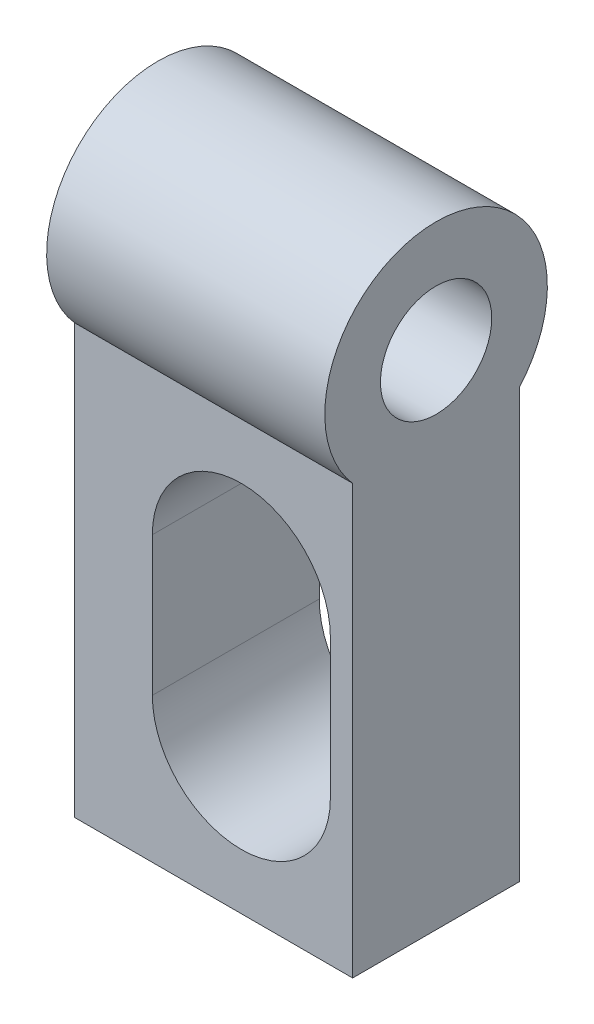
ISO-10303-21;
HEADER;
FILE_DESCRIPTION(('STEP AP214'),'2;1');
FILE_NAME('part.step','',(''),(''),'','','');
FILE_SCHEMA(('AUTOMOTIVE_DESIGN { 1 0 10303 214 1 1 1 1 }'));
ENDSEC;
DATA;
#1=APPLICATION_CONTEXT('core data for automotive mechanical design processes');
#2=APPLICATION_PROTOCOL_DEFINITION('international standard','automotive_design',2000,#1);
#3=PRODUCT_CONTEXT('',#1,'mechanical');
#4=PRODUCT('Part','Part','',(#3));
#5=PRODUCT_RELATED_PRODUCT_CATEGORY('part','',(#4));
#6=PRODUCT_DEFINITION_FORMATION('','',#4);
#7=PRODUCT_DEFINITION_CONTEXT('part definition',#1,'design');
#8=PRODUCT_DEFINITION('design','',#6,#7);
#9=PRODUCT_DEFINITION_SHAPE('','',#8);
#10=(LENGTH_UNIT() NAMED_UNIT(*) SI_UNIT(.MILLI.,.METRE.));
#11=(NAMED_UNIT(*) PLANE_ANGLE_UNIT() SI_UNIT($,.RADIAN.));
#12=(NAMED_UNIT(*) SI_UNIT($,.STERADIAN.) SOLID_ANGLE_UNIT());
#13=UNCERTAINTY_MEASURE_WITH_UNIT(LENGTH_MEASURE(1.E-05),#10,'distance_accuracy_value','');
#14=(GEOMETRIC_REPRESENTATION_CONTEXT(3) GLOBAL_UNCERTAINTY_ASSIGNED_CONTEXT((#13)) GLOBAL_UNIT_ASSIGNED_CONTEXT((#10,
#11,#12)) REPRESENTATION_CONTEXT('',''));
#15=CARTESIAN_POINT('',(0.,0.,0.));
#16=DIRECTION('',(0.,0.,1.));
#17=DIRECTION('',(1.,0.,0.));
#18=AXIS2_PLACEMENT_3D('',#15,#16,#17);
#19=CARTESIAN_POINT('',(5.,0.,0.));
#20=DIRECTION('',(0.,0.,-1.));
#21=DIRECTION('',(0.,1.,0.));
#22=AXIS2_PLACEMENT_3D('',#19,#20,#21);
#23=PLANE('',#22);
#24=CARTESIAN_POINT('',(8.,5.1,0.));
#25=DIRECTION('',(0.,0.,-1.));
#26=DIRECTION('',(0.,1.,0.));
#27=AXIS2_PLACEMENT_3D('',#24,#25,#26);
#28=CIRCLE('',#27,1.6);
#29=CARTESIAN_POINT('',(9.6,5.1,0.));
#30=VERTEX_POINT('',#29);
#31=CARTESIAN_POINT('',(6.4,5.1,0.));
#32=VERTEX_POINT('',#31);
#33=EDGE_CURVE('E136',#30,#32,#28,.F.);
#34=ORIENTED_EDGE('',*,*,#33,.F.);
#35=DIRECTION('',(0.,1.,0.));
#36=VECTOR('',#35,1.);
#37=CARTESIAN_POINT('',(9.6,0.,0.));
#38=LINE('',#37,#36);
#39=CARTESIAN_POINT('',(9.6,2.6,0.));
#40=VERTEX_POINT('',#39);
#41=EDGE_CURVE('E142',#40,#30,#38,.T.);
#42=ORIENTED_EDGE('',*,*,#41,.F.);
#43=CARTESIAN_POINT('',(8.,2.6,0.));
#44=DIRECTION('',(0.,0.,-1.));
#45=DIRECTION('',(0.,1.,0.));
#46=AXIS2_PLACEMENT_3D('',#43,#44,#45);
#47=CIRCLE('',#46,1.6);
#48=CARTESIAN_POINT('',(6.4,2.6,0.));
#49=VERTEX_POINT('',#48);
#50=EDGE_CURVE('E140',#49,#40,#47,.F.);
#51=ORIENTED_EDGE('',*,*,#50,.F.);
#52=DIRECTION('',(0.,-1.,0.));
#53=VECTOR('',#52,1.);
#54=CARTESIAN_POINT('',(6.4,0.,0.));
#55=LINE('',#54,#53);
#56=EDGE_CURVE('E138',#32,#49,#55,.T.);
#57=ORIENTED_EDGE('',*,*,#56,.F.);
#58=EDGE_LOOP('',(#34,#42,#51,#57));
#59=FACE_BOUND('',#58,.T.);
#60=DIRECTION('',(0.,1.,0.));
#61=VECTOR('',#60,1.);
#62=CARTESIAN_POINT('',(5.,0.,0.));
#63=LINE('',#62,#61);
#64=CARTESIAN_POINT('',(5.,0.,0.));
#65=VERTEX_POINT('',#64);
#66=CARTESIAN_POINT('',(5.,7.7,0.));
#67=VERTEX_POINT('',#66);
#68=EDGE_CURVE('E102',#65,#67,#63,.T.);
#69=ORIENTED_EDGE('',*,*,#68,.F.);
#70=DIRECTION('',(-1.,0.,0.));
#71=VECTOR('',#70,1.);
#72=CARTESIAN_POINT('',(5.,0.,0.));
#73=LINE('',#72,#71);
#74=CARTESIAN_POINT('',(10.,0.,0.));
#75=VERTEX_POINT('',#74);
#76=EDGE_CURVE('E44',#75,#65,#73,.T.);
#77=ORIENTED_EDGE('',*,*,#76,.F.);
#78=DIRECTION('',(0.,-1.,0.));
#79=VECTOR('',#78,1.);
#80=CARTESIAN_POINT('',(10.,0.,0.));
#81=LINE('',#80,#79);
#82=CARTESIAN_POINT('',(10.,7.7,0.));
#83=VERTEX_POINT('',#82);
#84=EDGE_CURVE('E127',#83,#75,#81,.T.);
#85=ORIENTED_EDGE('',*,*,#84,.F.);
#86=DIRECTION('',(-1.,0.,0.));
#87=VECTOR('',#86,1.);
#88=CARTESIAN_POINT('',(5.,7.7,0.));
#89=LINE('',#88,#87);
#90=EDGE_CURVE('E11',#83,#67,#89,.T.);
#91=ORIENTED_EDGE('',*,*,#90,.T.);
#92=EDGE_LOOP('',(#69,#77,#85,#91));
#93=FACE_BOUND('',#92,.T.);
#94=ADVANCED_FACE('F35',(#59,#93),#23,.F.);
#95=CARTESIAN_POINT('',(5.,0.,-3.));
#96=DIRECTION('',(0.,0.,1.));
#97=DIRECTION('',(1.,0.,0.));
#98=AXIS2_PLACEMENT_3D('',#95,#96,#97);
#99=PLANE('',#98);
#100=CARTESIAN_POINT('',(8.,5.1,-3.));
#101=DIRECTION('',(0.,0.,1.));
#102=DIRECTION('',(1.,0.,0.));
#103=AXIS2_PLACEMENT_3D('',#100,#101,#102);
#104=CIRCLE('',#103,1.6);
#105=CARTESIAN_POINT('',(9.6,5.1,-3.));
#106=VERTEX_POINT('',#105);
#107=CARTESIAN_POINT('',(6.4,5.1,-3.));
#108=VERTEX_POINT('',#107);
#109=EDGE_CURVE('E161',#106,#108,#104,.T.);
#110=ORIENTED_EDGE('',*,*,#109,.T.);
#111=DIRECTION('',(0.,-1.,0.));
#112=VECTOR('',#111,1.);
#113=CARTESIAN_POINT('',(6.4,5.1,-3.));
#114=LINE('',#113,#112);
#115=CARTESIAN_POINT('',(6.4,2.6,-3.));
#116=VERTEX_POINT('',#115);
#117=EDGE_CURVE('E148',#108,#116,#114,.T.);
#118=ORIENTED_EDGE('',*,*,#117,.T.);
#119=CARTESIAN_POINT('',(8.,2.6,-3.));
#120=DIRECTION('',(0.,0.,1.));
#121=DIRECTION('',(1.,0.,0.));
#122=AXIS2_PLACEMENT_3D('',#119,#120,#121);
#123=CIRCLE('',#122,1.6);
#124=CARTESIAN_POINT('',(9.6,2.6,-3.));
#125=VERTEX_POINT('',#124);
#126=EDGE_CURVE('E155',#116,#125,#123,.T.);
#127=ORIENTED_EDGE('',*,*,#126,.T.);
#128=DIRECTION('',(0.,1.,0.));
#129=VECTOR('',#128,1.);
#130=CARTESIAN_POINT('',(9.6,5.1,-3.));
#131=LINE('',#130,#129);
#132=EDGE_CURVE('E158',#125,#106,#131,.T.);
#133=ORIENTED_EDGE('',*,*,#132,.T.);
#134=EDGE_LOOP('',(#110,#118,#127,#133));
#135=FACE_BOUND('',#134,.T.);
#136=DIRECTION('',(0.,-1.,0.));
#137=VECTOR('',#136,1.);
#138=CARTESIAN_POINT('',(5.,0.,-3.));
#139=LINE('',#138,#137);
#140=CARTESIAN_POINT('',(5.,7.7,-3.));
#141=VERTEX_POINT('',#140);
#142=CARTESIAN_POINT('',(5.,0.,-3.));
#143=VERTEX_POINT('',#142);
#144=EDGE_CURVE('E51',#141,#143,#139,.T.);
#145=ORIENTED_EDGE('',*,*,#144,.F.);
#146=DIRECTION('',(-1.,0.,0.));
#147=VECTOR('',#146,1.);
#148=CARTESIAN_POINT('',(5.,7.7,-3.));
#149=LINE('',#148,#147);
#150=CARTESIAN_POINT('',(10.,7.7,-3.));
#151=VERTEX_POINT('',#150);
#152=EDGE_CURVE('E119',#151,#141,#149,.T.);
#153=ORIENTED_EDGE('',*,*,#152,.F.);
#154=DIRECTION('',(0.,1.,0.));
#155=VECTOR('',#154,1.);
#156=CARTESIAN_POINT('',(10.,0.,-3.));
#157=LINE('',#156,#155);
#158=CARTESIAN_POINT('',(10.,0.,-3.));
#159=VERTEX_POINT('',#158);
#160=EDGE_CURVE('E130',#159,#151,#157,.T.);
#161=ORIENTED_EDGE('',*,*,#160,.F.);
#162=DIRECTION('',(-1.,0.,0.));
#163=VECTOR('',#162,1.);
#164=CARTESIAN_POINT('',(5.,0.,-3.));
#165=LINE('',#164,#163);
#166=EDGE_CURVE('E117',#159,#143,#165,.T.);
#167=ORIENTED_EDGE('',*,*,#166,.T.);
#168=EDGE_LOOP('',(#145,#153,#161,#167));
#169=FACE_BOUND('',#168,.T.);
#170=ADVANCED_FACE('F168',(#135,#169),#99,.F.);
#171=CARTESIAN_POINT('',(5.,9.0228756555323,-1.5));
#172=DIRECTION('',(-1.,0.,0.));
#173=DIRECTION('',(0.,0.,1.));
#174=AXIS2_PLACEMENT_3D('',#171,#172,#173);
#175=CYLINDRICAL_SURFACE('',#174,2.);
#176=ORIENTED_EDGE('',*,*,#152,.T.);
#177=CARTESIAN_POINT('',(5.,9.0228756555323,-1.5));
#178=DIRECTION('',(-1.,0.,0.));
#179=DIRECTION('',(0.,0.,1.));
#180=AXIS2_PLACEMENT_3D('',#177,#178,#179);
#181=CIRCLE('',#180,2.);
#182=EDGE_CURVE('E111',#141,#67,#181,.F.);
#183=ORIENTED_EDGE('',*,*,#182,.T.);
#184=ORIENTED_EDGE('',*,*,#90,.F.);
#185=CARTESIAN_POINT('',(10.,9.0228756555323,-1.5));
#186=DIRECTION('',(1.,0.,0.));
#187=DIRECTION('',(0.,0.,-1.));
#188=AXIS2_PLACEMENT_3D('',#185,#186,#187);
#189=CIRCLE('',#188,2.);
#190=EDGE_CURVE('E133',#83,#151,#189,.F.);
#191=ORIENTED_EDGE('',*,*,#190,.T.);
#192=EDGE_LOOP('',(#176,#183,#184,#191));
#193=FACE_BOUND('',#192,.T.);
#194=ADVANCED_FACE('F37',(#193),#175,.T.);
#195=CARTESIAN_POINT('',(5.,0.,0.));
#196=DIRECTION('',(0.,1.,0.));
#197=DIRECTION('',(0.,0.,1.));
#198=AXIS2_PLACEMENT_3D('',#195,#196,#197);
#199=PLANE('',#198);
#200=DIRECTION('',(0.,0.,1.));
#201=VECTOR('',#200,1.);
#202=CARTESIAN_POINT('',(5.,0.,0.));
#203=LINE('',#202,#201);
#204=EDGE_CURVE('E98',#143,#65,#203,.T.);
#205=ORIENTED_EDGE('',*,*,#204,.F.);
#206=ORIENTED_EDGE('',*,*,#166,.F.);
#207=DIRECTION('',(0.,0.,-1.));
#208=VECTOR('',#207,1.);
#209=CARTESIAN_POINT('',(10.,0.,0.));
#210=LINE('',#209,#208);
#211=EDGE_CURVE('E115',#75,#159,#210,.T.);
#212=ORIENTED_EDGE('',*,*,#211,.F.);
#213=ORIENTED_EDGE('',*,*,#76,.T.);
#214=EDGE_LOOP('',(#205,#206,#212,#213));
#215=FACE_BOUND('',#214,.T.);
#216=ADVANCED_FACE('F113',(#215),#199,.F.);
#217=CARTESIAN_POINT('',(5.,9.0228756555323,-1.5));
#218=DIRECTION('',(-1.,0.,0.));
#219=DIRECTION('',(0.,0.,1.));
#220=AXIS2_PLACEMENT_3D('',#217,#218,#219);
#221=CYLINDRICAL_SURFACE('',#220,1.);
#222=CARTESIAN_POINT('',(10.,9.0228756555323,-1.5));
#223=DIRECTION('',(1.,0.,0.));
#224=DIRECTION('',(0.,0.,-1.));
#225=AXIS2_PLACEMENT_3D('',#222,#223,#224);
#226=CIRCLE('',#225,1.);
#227=CARTESIAN_POINT('',(10.,9.0228756555323,-2.5));
#228=VERTEX_POINT('',#227);
#229=EDGE_CURVE('E124',#228,#228,#226,.T.);
#230=ORIENTED_EDGE('',*,*,#229,.T.);
#231=EDGE_LOOP('',(#230));
#232=FACE_BOUND('',#231,.T.);
#233=CARTESIAN_POINT('',(5.,9.0228756555323,-1.5));
#234=DIRECTION('',(-1.,0.,0.));
#235=DIRECTION('',(0.,0.,1.));
#236=AXIS2_PLACEMENT_3D('',#233,#234,#235);
#237=CIRCLE('',#236,1.);
#238=CARTESIAN_POINT('',(5.,9.0228756555323,-0.499999999999999));
#239=VERTEX_POINT('',#238);
#240=EDGE_CURVE('E39',#239,#239,#237,.T.);
#241=ORIENTED_EDGE('',*,*,#240,.T.);
#242=EDGE_LOOP('',(#241));
#243=FACE_BOUND('',#242,.T.);
#244=ADVANCED_FACE('F175',(#232,#243),#221,.F.);
#245=CARTESIAN_POINT('',(10.,0.,0.));
#246=DIRECTION('',(-1.,0.,0.));
#247=DIRECTION('',(0.,0.,-1.));
#248=AXIS2_PLACEMENT_3D('',#245,#246,#247);
#249=PLANE('',#248);
#250=ORIENTED_EDGE('',*,*,#190,.F.);
#251=ORIENTED_EDGE('',*,*,#84,.T.);
#252=ORIENTED_EDGE('',*,*,#211,.T.);
#253=ORIENTED_EDGE('',*,*,#160,.T.);
#254=EDGE_LOOP('',(#250,#251,#252,#253));
#255=FACE_BOUND('',#254,.T.);
#256=ORIENTED_EDGE('',*,*,#229,.F.);
#257=EDGE_LOOP('',(#256));
#258=FACE_BOUND('',#257,.T.);
#259=ADVANCED_FACE('F171',(#255,#258),#249,.F.);
#260=CARTESIAN_POINT('',(8.,5.1,0.5));
#261=DIRECTION('',(0.,0.,-1.));
#262=DIRECTION('',(-1.,0.,0.));
#263=AXIS2_PLACEMENT_3D('',#260,#261,#262);
#264=CYLINDRICAL_SURFACE('',#263,1.6);
#265=ORIENTED_EDGE('',*,*,#33,.T.);
#266=DIRECTION('',(0.,0.,-1.));
#267=VECTOR('',#266,1.);
#268=CARTESIAN_POINT('',(6.4,5.1,0.5));
#269=LINE('',#268,#267);
#270=EDGE_CURVE('E144',#32,#108,#269,.T.);
#271=ORIENTED_EDGE('',*,*,#270,.T.);
#272=ORIENTED_EDGE('',*,*,#109,.F.);
#273=DIRECTION('',(0.,0.,-1.));
#274=VECTOR('',#273,1.);
#275=CARTESIAN_POINT('',(9.6,5.1,0.5));
#276=LINE('',#275,#274);
#277=EDGE_CURVE('E145',#30,#106,#276,.T.);
#278=ORIENTED_EDGE('',*,*,#277,.F.);
#279=EDGE_LOOP('',(#265,#271,#272,#278));
#280=FACE_BOUND('',#279,.T.);
#281=ADVANCED_FACE('F174',(#280),#264,.F.);
#282=CARTESIAN_POINT('',(6.4,5.1,0.5));
#283=DIRECTION('',(1.,0.,0.));
#284=DIRECTION('',(0.,1.,0.));
#285=AXIS2_PLACEMENT_3D('',#282,#283,#284);
#286=PLANE('',#285);
#287=ORIENTED_EDGE('',*,*,#56,.T.);
#288=DIRECTION('',(0.,0.,-1.));
#289=VECTOR('',#288,1.);
#290=CARTESIAN_POINT('',(6.4,2.6,0.5));
#291=LINE('',#290,#289);
#292=EDGE_CURVE('E150',#49,#116,#291,.T.);
#293=ORIENTED_EDGE('',*,*,#292,.T.);
#294=ORIENTED_EDGE('',*,*,#117,.F.);
#295=ORIENTED_EDGE('',*,*,#270,.F.);
#296=EDGE_LOOP('',(#287,#293,#294,#295));
#297=FACE_BOUND('',#296,.T.);
#298=ADVANCED_FACE('F205',(#297),#286,.T.);
#299=CARTESIAN_POINT('',(8.,2.6,0.5));
#300=DIRECTION('',(0.,0.,-1.));
#301=DIRECTION('',(-1.,0.,0.));
#302=AXIS2_PLACEMENT_3D('',#299,#300,#301);
#303=CYLINDRICAL_SURFACE('',#302,1.6);
#304=ORIENTED_EDGE('',*,*,#50,.T.);
#305=DIRECTION('',(0.,0.,-1.));
#306=VECTOR('',#305,1.);
#307=CARTESIAN_POINT('',(9.6,2.6,0.5));
#308=LINE('',#307,#306);
#309=EDGE_CURVE('E59',#40,#125,#308,.T.);
#310=ORIENTED_EDGE('',*,*,#309,.T.);
#311=ORIENTED_EDGE('',*,*,#126,.F.);
#312=ORIENTED_EDGE('',*,*,#292,.F.);
#313=EDGE_LOOP('',(#304,#310,#311,#312));
#314=FACE_BOUND('',#313,.T.);
#315=ADVANCED_FACE('F190',(#314),#303,.F.);
#316=CARTESIAN_POINT('',(9.6,5.1,0.5));
#317=DIRECTION('',(-1.,0.,0.));
#318=DIRECTION('',(0.,-1.,0.));
#319=AXIS2_PLACEMENT_3D('',#316,#317,#318);
#320=PLANE('',#319);
#321=ORIENTED_EDGE('',*,*,#41,.T.);
#322=ORIENTED_EDGE('',*,*,#277,.T.);
#323=ORIENTED_EDGE('',*,*,#132,.F.);
#324=ORIENTED_EDGE('',*,*,#309,.F.);
#325=EDGE_LOOP('',(#321,#322,#323,#324));
#326=FACE_BOUND('',#325,.T.);
#327=ADVANCED_FACE('F185',(#326),#320,.T.);
#328=CARTESIAN_POINT('',(5.,0.,0.));
#329=DIRECTION('',(-1.,0.,0.));
#330=DIRECTION('',(0.,0.,1.));
#331=AXIS2_PLACEMENT_3D('',#328,#329,#330);
#332=PLANE('',#331);
#333=ORIENTED_EDGE('',*,*,#144,.T.);
#334=ORIENTED_EDGE('',*,*,#204,.T.);
#335=ORIENTED_EDGE('',*,*,#68,.T.);
#336=ORIENTED_EDGE('',*,*,#182,.F.);
#337=EDGE_LOOP('',(#333,#334,#335,#336));
#338=FACE_BOUND('',#337,.T.);
#339=ORIENTED_EDGE('',*,*,#240,.F.);
#340=EDGE_LOOP('',(#339));
#341=FACE_BOUND('',#340,.T.);
#342=ADVANCED_FACE('F100',(#338,#341),#332,.T.);
#343=CLOSED_SHELL('',(#94,#170,#194,#216,#244,#259,#281,#298,#315,#327,#342));
#344=MANIFOLD_SOLID_BREP('B2',#343);
#345=ADVANCED_BREP_SHAPE_REPRESENTATION('',(#18,#344),#14);
#346=SHAPE_DEFINITION_REPRESENTATION(#9,#345);
ENDSEC;
END-ISO-10303-21;
